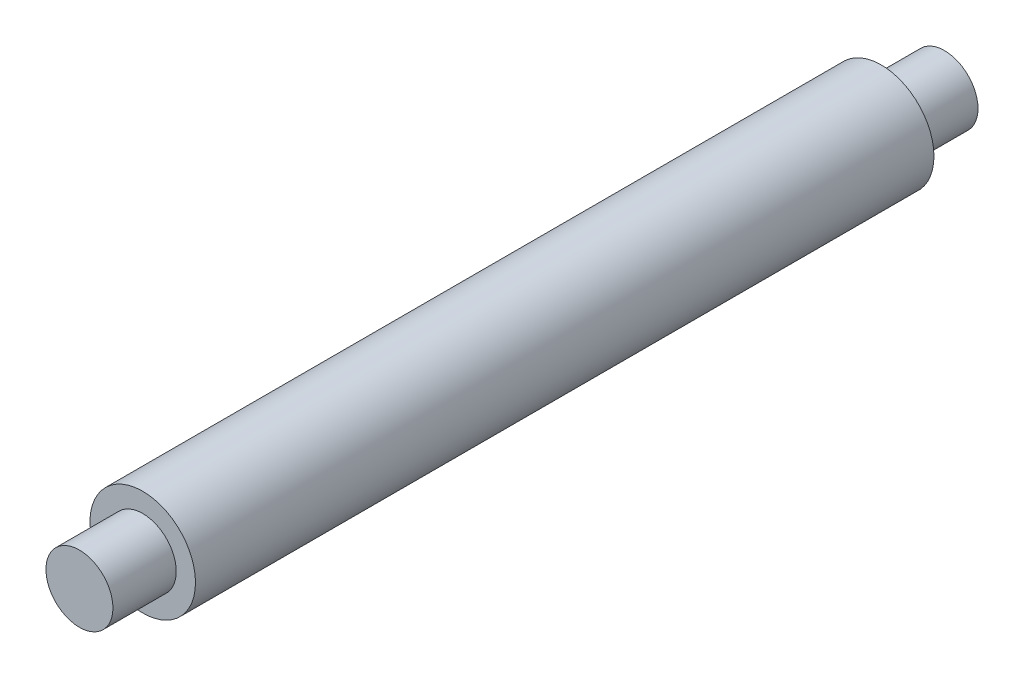
ISO-10303-21;
HEADER;
FILE_DESCRIPTION(('STEP AP214'),'2;1');
FILE_NAME('part.step','',(''),(''),'','','');
FILE_SCHEMA(('AUTOMOTIVE_DESIGN { 1 0 10303 214 1 1 1 1 }'));
ENDSEC;
DATA;
#1=APPLICATION_CONTEXT('core data for automotive mechanical design processes');
#2=APPLICATION_PROTOCOL_DEFINITION('international standard','automotive_design',2000,#1);
#3=PRODUCT_CONTEXT('',#1,'mechanical');
#4=PRODUCT('Part','Part','',(#3));
#5=PRODUCT_RELATED_PRODUCT_CATEGORY('part','',(#4));
#6=PRODUCT_DEFINITION_FORMATION('','',#4);
#7=PRODUCT_DEFINITION_CONTEXT('part definition',#1,'design');
#8=PRODUCT_DEFINITION('design','',#6,#7);
#9=PRODUCT_DEFINITION_SHAPE('','',#8);
#10=(LENGTH_UNIT() NAMED_UNIT(*) SI_UNIT(.MILLI.,.METRE.));
#11=(NAMED_UNIT(*) PLANE_ANGLE_UNIT() SI_UNIT($,.RADIAN.));
#12=(NAMED_UNIT(*) SI_UNIT($,.STERADIAN.) SOLID_ANGLE_UNIT());
#13=UNCERTAINTY_MEASURE_WITH_UNIT(LENGTH_MEASURE(1.E-05),#10,'distance_accuracy_value','');
#14=(GEOMETRIC_REPRESENTATION_CONTEXT(3) GLOBAL_UNCERTAINTY_ASSIGNED_CONTEXT((#13)) GLOBAL_UNIT_ASSIGNED_CONTEXT((#10,
#11,#12)) REPRESENTATION_CONTEXT('',''));
#15=CARTESIAN_POINT('',(0.,0.,0.));
#16=DIRECTION('',(0.,0.,1.));
#17=DIRECTION('',(1.,0.,0.));
#18=AXIS2_PLACEMENT_3D('',#15,#16,#17);
#19=CARTESIAN_POINT('',(0.,0.,35.));
#20=DIRECTION('',(0.,0.,-1.));
#21=DIRECTION('',(-1.,0.,0.));
#22=AXIS2_PLACEMENT_3D('',#19,#20,#21);
#23=CYLINDRICAL_SURFACE('',#22,3.175);
#24=CARTESIAN_POINT('',(0.,0.,35.));
#25=DIRECTION('',(0.,0.,1.));
#26=DIRECTION('',(1.,0.,0.));
#27=AXIS2_PLACEMENT_3D('',#24,#25,#26);
#28=CIRCLE('',#27,3.175);
#29=CARTESIAN_POINT('',(3.175,0.,35.));
#30=VERTEX_POINT('',#29);
#31=EDGE_CURVE('E51',#30,#30,#28,.T.);
#32=ORIENTED_EDGE('',*,*,#31,.T.);
#33=EDGE_LOOP('',(#32));
#34=FACE_BOUND('',#33,.T.);
#35=CARTESIAN_POINT('',(0.,0.,-35.));
#36=DIRECTION('',(0.,0.,1.));
#37=DIRECTION('',(1.,0.,0.));
#38=AXIS2_PLACEMENT_3D('',#35,#36,#37);
#39=CIRCLE('',#38,3.175);
#40=CARTESIAN_POINT('',(3.175,0.,-35.));
#41=VERTEX_POINT('',#40);
#42=EDGE_CURVE('E57',#41,#41,#39,.T.);
#43=ORIENTED_EDGE('',*,*,#42,.F.);
#44=EDGE_LOOP('',(#43));
#45=FACE_BOUND('',#44,.T.);
#46=ADVANCED_FACE('F44',(#34,#45),#23,.F.);
#47=CARTESIAN_POINT('',(0.,0.,35.));
#48=DIRECTION('',(0.,0.,-1.));
#49=DIRECTION('',(-1.,0.,0.));
#50=AXIS2_PLACEMENT_3D('',#47,#48,#49);
#51=CYLINDRICAL_SURFACE('',#50,5.);
#52=CARTESIAN_POINT('',(0.,0.,35.));
#53=DIRECTION('',(0.,0.,1.));
#54=DIRECTION('',(1.,0.,0.));
#55=AXIS2_PLACEMENT_3D('',#52,#53,#54);
#56=CIRCLE('',#55,5.);
#57=CARTESIAN_POINT('',(5.,0.,35.));
#58=VERTEX_POINT('',#57);
#59=EDGE_CURVE('E11',#58,#58,#56,.T.);
#60=ORIENTED_EDGE('',*,*,#59,.F.);
#61=EDGE_LOOP('',(#60));
#62=FACE_BOUND('',#61,.T.);
#63=CARTESIAN_POINT('',(0.,0.,-35.));
#64=DIRECTION('',(0.,0.,1.));
#65=DIRECTION('',(1.,0.,0.));
#66=AXIS2_PLACEMENT_3D('',#63,#64,#65);
#67=CIRCLE('',#66,5.);
#68=CARTESIAN_POINT('',(5.,0.,-35.));
#69=VERTEX_POINT('',#68);
#70=EDGE_CURVE('E47',#69,#69,#67,.T.);
#71=ORIENTED_EDGE('',*,*,#70,.T.);
#72=EDGE_LOOP('',(#71));
#73=FACE_BOUND('',#72,.T.);
#74=ADVANCED_FACE('F64',(#62,#73),#51,.T.);
#75=CARTESIAN_POINT('',(0.,0.,35.));
#76=DIRECTION('',(0.,0.,1.));
#77=DIRECTION('',(1.,0.,0.));
#78=AXIS2_PLACEMENT_3D('',#75,#76,#77);
#79=PLANE('',#78);
#80=ORIENTED_EDGE('',*,*,#31,.F.);
#81=EDGE_LOOP('',(#80));
#82=FACE_BOUND('',#81,.T.);
#83=ORIENTED_EDGE('',*,*,#59,.T.);
#84=EDGE_LOOP('',(#83));
#85=FACE_BOUND('',#84,.T.);
#86=ADVANCED_FACE('F68',(#82,#85),#79,.T.);
#87=CARTESIAN_POINT('',(0.,0.,-35.));
#88=DIRECTION('',(0.,0.,1.));
#89=DIRECTION('',(1.,0.,0.));
#90=AXIS2_PLACEMENT_3D('',#87,#88,#89);
#91=PLANE('',#90);
#92=ORIENTED_EDGE('',*,*,#42,.T.);
#93=EDGE_LOOP('',(#92));
#94=FACE_BOUND('',#93,.T.);
#95=ORIENTED_EDGE('',*,*,#70,.F.);
#96=EDGE_LOOP('',(#95));
#97=FACE_BOUND('',#96,.T.);
#98=ADVANCED_FACE('F66',(#94,#97),#91,.F.);
#99=CLOSED_SHELL('',(#46,#74,#86,#98));
#100=MANIFOLD_SOLID_BREP('B2',#99);
#101=CARTESIAN_POINT('',(0.,0.,41.));
#102=DIRECTION('',(0.,0.,-1.));
#103=DIRECTION('',(-1.,0.,0.));
#104=AXIS2_PLACEMENT_3D('',#101,#102,#103);
#105=CYLINDRICAL_SURFACE('',#104,3.175);
#106=CARTESIAN_POINT('',(0.,0.,41.));
#107=DIRECTION('',(0.,0.,1.));
#108=DIRECTION('',(1.,0.,0.));
#109=AXIS2_PLACEMENT_3D('',#106,#107,#108);
#110=CIRCLE('',#109,3.175);
#111=CARTESIAN_POINT('',(3.175,0.,41.));
#112=VERTEX_POINT('',#111);
#113=EDGE_CURVE('E43',#112,#112,#110,.T.);
#114=ORIENTED_EDGE('',*,*,#113,.F.);
#115=EDGE_LOOP('',(#114));
#116=FACE_BOUND('',#115,.T.);
#117=CARTESIAN_POINT('',(0.,0.,-41.));
#118=DIRECTION('',(0.,0.,1.));
#119=DIRECTION('',(1.,0.,0.));
#120=AXIS2_PLACEMENT_3D('',#117,#118,#119);
#121=CIRCLE('',#120,3.175);
#122=CARTESIAN_POINT('',(3.175,0.,-41.));
#123=VERTEX_POINT('',#122);
#124=EDGE_CURVE('E108',#123,#123,#121,.T.);
#125=ORIENTED_EDGE('',*,*,#124,.T.);
#126=EDGE_LOOP('',(#125));
#127=FACE_BOUND('',#126,.T.);
#128=ADVANCED_FACE('F105',(#116,#127),#105,.T.);
#129=CARTESIAN_POINT('',(0.,0.,41.));
#130=DIRECTION('',(0.,0.,1.));
#131=DIRECTION('',(1.,0.,0.));
#132=AXIS2_PLACEMENT_3D('',#129,#130,#131);
#133=PLANE('',#132);
#134=ORIENTED_EDGE('',*,*,#113,.T.);
#135=EDGE_LOOP('',(#134));
#136=FACE_BOUND('',#135,.T.);
#137=ADVANCED_FACE('F120',(#136),#133,.T.);
#138=CARTESIAN_POINT('',(0.,0.,-41.));
#139=DIRECTION('',(0.,0.,1.));
#140=DIRECTION('',(1.,0.,0.));
#141=AXIS2_PLACEMENT_3D('',#138,#139,#140);
#142=PLANE('',#141);
#143=ORIENTED_EDGE('',*,*,#124,.F.);
#144=EDGE_LOOP('',(#143));
#145=FACE_BOUND('',#144,.T.);
#146=ADVANCED_FACE('F118',(#145),#142,.F.);
#147=CLOSED_SHELL('',(#128,#137,#146));
#148=MANIFOLD_SOLID_BREP('B6',#147);
#149=ADVANCED_BREP_SHAPE_REPRESENTATION('',(#18,#100,#148),#14);
#150=SHAPE_DEFINITION_REPRESENTATION(#9,#149);
ENDSEC;
END-ISO-10303-21;
